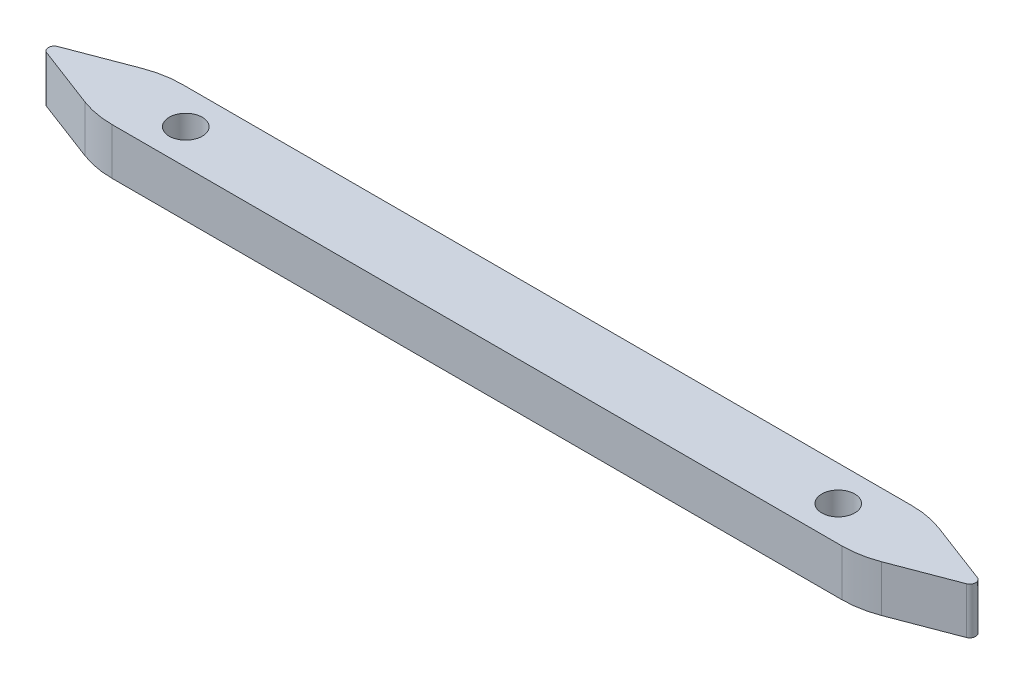
ISO-10303-21;
HEADER;
FILE_DESCRIPTION(('STEP AP214'),'2;1');
FILE_NAME('part.step','',(''),(''),'','','');
FILE_SCHEMA(('AUTOMOTIVE_DESIGN { 1 0 10303 214 1 1 1 1 }'));
ENDSEC;
DATA;
#1=APPLICATION_CONTEXT('core data for automotive mechanical design processes');
#2=APPLICATION_PROTOCOL_DEFINITION('international standard','automotive_design',2000,#1);
#3=PRODUCT_CONTEXT('',#1,'mechanical');
#4=PRODUCT('Part','Part','',(#3));
#5=PRODUCT_RELATED_PRODUCT_CATEGORY('part','',(#4));
#6=PRODUCT_DEFINITION_FORMATION('','',#4);
#7=PRODUCT_DEFINITION_CONTEXT('part definition',#1,'design');
#8=PRODUCT_DEFINITION('design','',#6,#7);
#9=PRODUCT_DEFINITION_SHAPE('','',#8);
#10=(LENGTH_UNIT() NAMED_UNIT(*) SI_UNIT(.MILLI.,.METRE.));
#11=(NAMED_UNIT(*) PLANE_ANGLE_UNIT() SI_UNIT($,.RADIAN.));
#12=(NAMED_UNIT(*) SI_UNIT($,.STERADIAN.) SOLID_ANGLE_UNIT());
#13=UNCERTAINTY_MEASURE_WITH_UNIT(LENGTH_MEASURE(1.E-05),#10,'distance_accuracy_value','');
#14=(GEOMETRIC_REPRESENTATION_CONTEXT(3) GLOBAL_UNCERTAINTY_ASSIGNED_CONTEXT((#13)) GLOBAL_UNIT_ASSIGNED_CONTEXT((#10,
#11,#12)) REPRESENTATION_CONTEXT('',''));
#15=CARTESIAN_POINT('',(0.,0.,0.));
#16=DIRECTION('',(0.,0.,1.));
#17=DIRECTION('',(1.,0.,0.));
#18=AXIS2_PLACEMENT_3D('',#15,#16,#17);
#19=CARTESIAN_POINT('',(-62.3678648511801,-10.,0.));
#20=DIRECTION('',(0.,1.,0.));
#21=DIRECTION('',(0.,0.,1.));
#22=AXIS2_PLACEMENT_3D('',#19,#20,#21);
#23=CYLINDRICAL_SURFACE('',#22,0.793750000000001);
#24=CARTESIAN_POINT('',(-62.3678648511801,9.525,0.));
#25=DIRECTION('',(0.,1.,0.));
#26=DIRECTION('',(0.,0.,1.));
#27=AXIS2_PLACEMENT_3D('',#24,#25,#26);
#28=CIRCLE('',#27,0.793750000000001);
#29=CARTESIAN_POINT('',(-62.6498189486751,9.525,0.741984467092002));
#30=VERTEX_POINT('',#29);
#31=CARTESIAN_POINT('',(-62.6498189486751,9.525,-0.741984467092001));
#32=VERTEX_POINT('',#31);
#33=EDGE_CURVE('E211',#30,#32,#28,.F.);
#34=ORIENTED_EDGE('',*,*,#33,.F.);
#35=DIRECTION('',(0.,1.,0.));
#36=VECTOR('',#35,1.);
#37=CARTESIAN_POINT('',(-62.6498189486751,-10.,0.741984467092001));
#38=LINE('',#37,#36);
#39=CARTESIAN_POINT('',(-62.6498189486751,15.875,0.741984467092002));
#40=VERTEX_POINT('',#39);
#41=EDGE_CURVE('E171',#30,#40,#38,.T.);
#42=ORIENTED_EDGE('',*,*,#41,.T.);
#43=CARTESIAN_POINT('',(-62.3678648511801,15.875,0.));
#44=DIRECTION('',(0.,1.,0.));
#45=DIRECTION('',(0.,0.,1.));
#46=AXIS2_PLACEMENT_3D('',#43,#44,#45);
#47=CIRCLE('',#46,0.793750000000001);
#48=CARTESIAN_POINT('',(-62.6498189486751,15.875,-0.741984467092001));
#49=VERTEX_POINT('',#48);
#50=EDGE_CURVE('E185',#40,#49,#47,.F.);
#51=ORIENTED_EDGE('',*,*,#50,.T.);
#52=DIRECTION('',(0.,1.,0.));
#53=VECTOR('',#52,1.);
#54=CARTESIAN_POINT('',(-62.6498189486751,-10.,-0.741984467092001));
#55=LINE('',#54,#53);
#56=EDGE_CURVE('E170',#32,#49,#55,.T.);
#57=ORIENTED_EDGE('',*,*,#56,.F.);
#58=EDGE_LOOP('',(#34,#42,#51,#57));
#59=FACE_BOUND('',#58,.T.);
#60=ADVANCED_FACE('F33',(#59),#23,.T.);
#61=CARTESIAN_POINT('',(62.3678648511801,-10.,0.));
#62=DIRECTION('',(0.,1.,0.));
#63=DIRECTION('',(0.,0.,1.));
#64=AXIS2_PLACEMENT_3D('',#61,#62,#63);
#65=CYLINDRICAL_SURFACE('',#64,0.793750000000015);
#66=CARTESIAN_POINT('',(62.3678648511801,9.525,0.));
#67=DIRECTION('',(0.,1.,0.));
#68=DIRECTION('',(0.,0.,1.));
#69=AXIS2_PLACEMENT_3D('',#66,#67,#68);
#70=CIRCLE('',#69,0.793750000000015);
#71=CARTESIAN_POINT('',(62.6498189486751,9.525,-0.741984467092015));
#72=VERTEX_POINT('',#71);
#73=CARTESIAN_POINT('',(62.6498189486751,9.525,0.741984467092003));
#74=VERTEX_POINT('',#73);
#75=EDGE_CURVE('E217',#72,#74,#70,.F.);
#76=ORIENTED_EDGE('',*,*,#75,.F.);
#77=DIRECTION('',(0.,1.,0.));
#78=VECTOR('',#77,1.);
#79=CARTESIAN_POINT('',(62.6498189486751,-10.,-0.741984467092032));
#80=LINE('',#79,#78);
#81=CARTESIAN_POINT('',(62.6498189486751,15.875,-0.741984467092015));
#82=VERTEX_POINT('',#81);
#83=EDGE_CURVE('E176',#72,#82,#80,.T.);
#84=ORIENTED_EDGE('',*,*,#83,.T.);
#85=CARTESIAN_POINT('',(62.3678648511801,15.875,0.));
#86=DIRECTION('',(0.,1.,0.));
#87=DIRECTION('',(0.,0.,1.));
#88=AXIS2_PLACEMENT_3D('',#85,#86,#87);
#89=CIRCLE('',#88,0.793750000000015);
#90=CARTESIAN_POINT('',(62.6498189486751,15.875,0.741984467092003));
#91=VERTEX_POINT('',#90);
#92=EDGE_CURVE('E194',#82,#91,#89,.F.);
#93=ORIENTED_EDGE('',*,*,#92,.T.);
#94=DIRECTION('',(0.,1.,0.));
#95=VECTOR('',#94,1.);
#96=CARTESIAN_POINT('',(62.6498189486751,-10.,0.741984467092017));
#97=LINE('',#96,#95);
#98=EDGE_CURVE('E173',#74,#91,#97,.T.);
#99=ORIENTED_EDGE('',*,*,#98,.F.);
#100=EDGE_LOOP('',(#76,#84,#93,#99));
#101=FACE_BOUND('',#100,.T.);
#102=ADVANCED_FACE('F229',(#101),#65,.T.);
#103=CARTESIAN_POINT('',(-41.7162215634645,-10.,-8.69675147347203));
#104=DIRECTION('',(-0.355217760623573,0.,-0.934783580588349));
#105=DIRECTION('',(-0.934783580588349,0.,0.355217760623573));
#106=AXIS2_PLACEMENT_3D('',#103,#104,#105);
#107=PLANE('',#106);
#108=DIRECTION('',(0.934783580588349,0.,-0.355217760623573));
#109=VECTOR('',#108,1.);
#110=CARTESIAN_POINT('',(-41.7162215634645,9.525,-8.69675147347203));
#111=LINE('',#110,#109);
#112=CARTESIAN_POINT('',(-54.2491163003066,9.525,-3.93425147347203));
#113=VERTEX_POINT('',#112);
#114=EDGE_CURVE('E56',#32,#113,#111,.T.);
#115=ORIENTED_EDGE('',*,*,#114,.F.);
#116=ORIENTED_EDGE('',*,*,#56,.T.);
#117=DIRECTION('',(0.934783580588349,0.,-0.355217760623573));
#118=VECTOR('',#117,1.);
#119=CARTESIAN_POINT('',(-41.7162215634645,15.875,-8.69675147347203));
#120=LINE('',#119,#118);
#121=CARTESIAN_POINT('',(-54.2491163003066,15.875,-3.93425147347202));
#122=VERTEX_POINT('',#121);
#123=EDGE_CURVE('E136',#49,#122,#120,.T.);
#124=ORIENTED_EDGE('',*,*,#123,.T.);
#125=DIRECTION('',(0.,-1.,0.));
#126=VECTOR('',#125,1.);
#127=CARTESIAN_POINT('',(-54.2491163003066,-10.,-3.93425147347203));
#128=LINE('',#127,#126);
#129=EDGE_CURVE('E138',#122,#113,#128,.T.);
#130=ORIENTED_EDGE('',*,*,#129,.T.);
#131=EDGE_LOOP('',(#115,#116,#124,#130));
#132=FACE_BOUND('',#131,.T.);
#133=ADVANCED_FACE('F257',(#132),#107,.T.);
#134=CARTESIAN_POINT('',(41.7162215634645,-10.,-8.69675147347204));
#135=DIRECTION('',(0.355217760623573,0.,-0.934783580588349));
#136=DIRECTION('',(-0.934783580588349,0.,-0.355217760623573));
#137=AXIS2_PLACEMENT_3D('',#134,#135,#136);
#138=PLANE('',#137);
#139=DIRECTION('',(0.934783580588349,0.,0.355217760623573));
#140=VECTOR('',#139,1.);
#141=CARTESIAN_POINT('',(41.7162215634645,9.525,-8.69675147347204));
#142=LINE('',#141,#140);
#143=CARTESIAN_POINT('',(54.2491163003067,9.525,-3.93425147347203));
#144=VERTEX_POINT('',#143);
#145=EDGE_CURVE('E219',#144,#72,#142,.T.);
#146=ORIENTED_EDGE('',*,*,#145,.F.);
#147=DIRECTION('',(0.,1.,0.));
#148=VECTOR('',#147,1.);
#149=CARTESIAN_POINT('',(54.2491163003067,-10.,-3.93425147347203));
#150=LINE('',#149,#148);
#151=CARTESIAN_POINT('',(54.2491163003067,15.875,-3.93425147347203));
#152=VERTEX_POINT('',#151);
#153=EDGE_CURVE('E167',#144,#152,#150,.T.);
#154=ORIENTED_EDGE('',*,*,#153,.T.);
#155=DIRECTION('',(0.934783580588349,0.,0.355217760623573));
#156=VECTOR('',#155,1.);
#157=CARTESIAN_POINT('',(41.7162215634645,15.875,-8.69675147347204));
#158=LINE('',#157,#156);
#159=EDGE_CURVE('E197',#152,#82,#158,.T.);
#160=ORIENTED_EDGE('',*,*,#159,.T.);
#161=ORIENTED_EDGE('',*,*,#83,.F.);
#162=EDGE_LOOP('',(#146,#154,#160,#161));
#163=FACE_BOUND('',#162,.T.);
#164=ADVANCED_FACE('F231',(#163),#138,.T.);
#165=CARTESIAN_POINT('',(41.7162215634645,-10.,8.69675147347204));
#166=DIRECTION('',(0.355217760623573,0.,0.934783580588349));
#167=DIRECTION('',(0.934783580588349,0.,-0.355217760623573));
#168=AXIS2_PLACEMENT_3D('',#165,#166,#167);
#169=PLANE('',#168);
#170=DIRECTION('',(-0.934783580588349,0.,0.355217760623573));
#171=VECTOR('',#170,1.);
#172=CARTESIAN_POINT('',(41.7162215634645,9.525,8.69675147347204));
#173=LINE('',#172,#171);
#174=CARTESIAN_POINT('',(54.2491163003067,9.525,3.93425147347203));
#175=VERTEX_POINT('',#174);
#176=EDGE_CURVE('E215',#74,#175,#173,.T.);
#177=ORIENTED_EDGE('',*,*,#176,.F.);
#178=ORIENTED_EDGE('',*,*,#98,.T.);
#179=DIRECTION('',(-0.934783580588349,0.,0.355217760623573));
#180=VECTOR('',#179,1.);
#181=CARTESIAN_POINT('',(41.7162215634645,15.875,8.69675147347204));
#182=LINE('',#181,#180);
#183=CARTESIAN_POINT('',(54.2491163003067,15.875,3.93425147347203));
#184=VERTEX_POINT('',#183);
#185=EDGE_CURVE('E191',#91,#184,#182,.T.);
#186=ORIENTED_EDGE('',*,*,#185,.T.);
#187=DIRECTION('',(0.,-1.,0.));
#188=VECTOR('',#187,1.);
#189=CARTESIAN_POINT('',(54.2491163003067,-10.,3.93425147347203));
#190=LINE('',#189,#188);
#191=EDGE_CURVE('E159',#184,#175,#190,.T.);
#192=ORIENTED_EDGE('',*,*,#191,.T.);
#193=EDGE_LOOP('',(#177,#178,#186,#192));
#194=FACE_BOUND('',#193,.T.);
#195=ADVANCED_FACE('F265',(#194),#169,.T.);
#196=CARTESIAN_POINT('',(-41.7162215634645,-10.,8.69675147347203));
#197=DIRECTION('',(-0.355217760623573,0.,0.934783580588349));
#198=DIRECTION('',(0.934783580588349,0.,0.355217760623573));
#199=AXIS2_PLACEMENT_3D('',#196,#197,#198);
#200=PLANE('',#199);
#201=DIRECTION('',(-0.934783580588349,0.,-0.355217760623573));
#202=VECTOR('',#201,1.);
#203=CARTESIAN_POINT('',(-41.7162215634645,9.525,8.69675147347203));
#204=LINE('',#203,#202);
#205=CARTESIAN_POINT('',(-54.2491163003066,9.525,3.93425147347202));
#206=VERTEX_POINT('',#205);
#207=EDGE_CURVE('E213',#206,#30,#204,.T.);
#208=ORIENTED_EDGE('',*,*,#207,.F.);
#209=DIRECTION('',(0.,1.,0.));
#210=VECTOR('',#209,1.);
#211=CARTESIAN_POINT('',(-54.2491163003066,-10.,3.93425147347203));
#212=LINE('',#211,#210);
#213=CARTESIAN_POINT('',(-54.2491163003066,15.875,3.93425147347202));
#214=VERTEX_POINT('',#213);
#215=EDGE_CURVE('E149',#206,#214,#212,.T.);
#216=ORIENTED_EDGE('',*,*,#215,.T.);
#217=DIRECTION('',(-0.934783580588349,0.,-0.355217760623573));
#218=VECTOR('',#217,1.);
#219=CARTESIAN_POINT('',(-41.7162215634645,15.875,8.69675147347203));
#220=LINE('',#219,#218);
#221=EDGE_CURVE('E188',#214,#40,#220,.T.);
#222=ORIENTED_EDGE('',*,*,#221,.T.);
#223=ORIENTED_EDGE('',*,*,#41,.F.);
#224=EDGE_LOOP('',(#208,#216,#222,#223));
#225=FACE_BOUND('',#224,.T.);
#226=ADVANCED_FACE('F261',(#225),#200,.T.);
#227=CARTESIAN_POINT('',(44.45,22.225,0.));
#228=DIRECTION('',(0.,1.,0.));
#229=DIRECTION('',(0.,0.,1.));
#230=AXIS2_PLACEMENT_3D('',#227,#228,#229);
#231=CYLINDRICAL_SURFACE('',#230,2.24789999999999);
#232=CARTESIAN_POINT('',(44.45,9.525,0.));
#233=DIRECTION('',(0.,1.,0.));
#234=DIRECTION('',(0.,0.,1.));
#235=AXIS2_PLACEMENT_3D('',#232,#233,#234);
#236=CIRCLE('',#235,2.24789999999999);
#237=CARTESIAN_POINT('',(44.45,9.525,2.24789999999999));
#238=VERTEX_POINT('',#237);
#239=EDGE_CURVE('E205',#238,#238,#236,.F.);
#240=ORIENTED_EDGE('',*,*,#239,.T.);
#241=EDGE_LOOP('',(#240));
#242=FACE_BOUND('',#241,.T.);
#243=CARTESIAN_POINT('',(44.45,15.875,0.));
#244=DIRECTION('',(0.,1.,0.));
#245=DIRECTION('',(0.,0.,1.));
#246=AXIS2_PLACEMENT_3D('',#243,#244,#245);
#247=CIRCLE('',#246,2.24789999999999);
#248=CARTESIAN_POINT('',(44.45,15.875,2.24789999999999));
#249=VERTEX_POINT('',#248);
#250=EDGE_CURVE('E200',#249,#249,#247,.F.);
#251=ORIENTED_EDGE('',*,*,#250,.F.);
#252=EDGE_LOOP('',(#251));
#253=FACE_BOUND('',#252,.T.);
#254=ADVANCED_FACE('F264',(#242,#253),#231,.F.);
#255=CARTESIAN_POINT('',(-44.45,22.225,0.));
#256=DIRECTION('',(0.,1.,0.));
#257=DIRECTION('',(0.,0.,1.));
#258=AXIS2_PLACEMENT_3D('',#255,#256,#257);
#259=CYLINDRICAL_SURFACE('',#258,2.24789999999999);
#260=CARTESIAN_POINT('',(-44.45,9.525,0.));
#261=DIRECTION('',(0.,1.,0.));
#262=DIRECTION('',(0.,0.,1.));
#263=AXIS2_PLACEMENT_3D('',#260,#261,#262);
#264=CIRCLE('',#263,2.24789999999999);
#265=CARTESIAN_POINT('',(-44.45,9.525,2.24789999999999));
#266=VERTEX_POINT('',#265);
#267=EDGE_CURVE('E208',#266,#266,#264,.F.);
#268=ORIENTED_EDGE('',*,*,#267,.T.);
#269=EDGE_LOOP('',(#268));
#270=FACE_BOUND('',#269,.T.);
#271=CARTESIAN_POINT('',(-44.45,15.875,0.));
#272=DIRECTION('',(0.,1.,0.));
#273=DIRECTION('',(0.,0.,1.));
#274=AXIS2_PLACEMENT_3D('',#271,#272,#273);
#275=CIRCLE('',#274,2.24789999999999);
#276=CARTESIAN_POINT('',(-44.45,15.875,2.24789999999999));
#277=VERTEX_POINT('',#276);
#278=EDGE_CURVE('E37',#277,#277,#275,.F.);
#279=ORIENTED_EDGE('',*,*,#278,.F.);
#280=EDGE_LOOP('',(#279));
#281=FACE_BOUND('',#280,.T.);
#282=ADVANCED_FACE('F276',(#270,#281),#259,.F.);
#283=CARTESIAN_POINT('',(0.,0.,4.76249999999999));
#284=DIRECTION('',(0.,0.,1.));
#285=DIRECTION('',(1.,0.,0.));
#286=AXIS2_PLACEMENT_3D('',#283,#284,#285);
#287=PLANE('',#286);
#288=DIRECTION('',(-1.,0.,0.));
#289=VECTOR('',#288,1.);
#290=CARTESIAN_POINT('',(-68.6771113456913,15.875,4.76249999999999));
#291=LINE('',#290,#289);
#292=CARTESIAN_POINT('',(49.7378507403873,15.875,4.7625));
#293=VERTEX_POINT('',#292);
#294=CARTESIAN_POINT('',(-49.7378507403872,15.875,4.76249999999999));
#295=VERTEX_POINT('',#294);
#296=EDGE_CURVE('E174',#293,#295,#291,.T.);
#297=ORIENTED_EDGE('',*,*,#296,.T.);
#298=DIRECTION('',(0.,1.,0.));
#299=VECTOR('',#298,1.);
#300=CARTESIAN_POINT('',(-49.7378507403872,0.,4.76249999999999));
#301=LINE('',#300,#299);
#302=CARTESIAN_POINT('',(-49.7378507403872,9.525,4.76249999999999));
#303=VERTEX_POINT('',#302);
#304=EDGE_CURVE('E146',#295,#303,#301,.F.);
#305=ORIENTED_EDGE('',*,*,#304,.T.);
#306=DIRECTION('',(1.,0.,0.));
#307=VECTOR('',#306,1.);
#308=CARTESIAN_POINT('',(-68.6771113456913,9.525,4.76249999999999));
#309=LINE('',#308,#307);
#310=CARTESIAN_POINT('',(49.7378507403873,9.525,4.7625));
#311=VERTEX_POINT('',#310);
#312=EDGE_CURVE('E181',#303,#311,#309,.T.);
#313=ORIENTED_EDGE('',*,*,#312,.T.);
#314=DIRECTION('',(0.,-1.,0.));
#315=VECTOR('',#314,1.);
#316=CARTESIAN_POINT('',(49.7378507403873,0.,4.76249999999999));
#317=LINE('',#316,#315);
#318=EDGE_CURVE('E156',#311,#293,#317,.F.);
#319=ORIENTED_EDGE('',*,*,#318,.T.);
#320=EDGE_LOOP('',(#297,#305,#313,#319));
#321=FACE_BOUND('',#320,.T.);
#322=ADVANCED_FACE('F248',(#321),#287,.T.);
#323=CARTESIAN_POINT('',(0.,0.,-4.76249999999999));
#324=DIRECTION('',(0.,0.,-1.));
#325=DIRECTION('',(-1.,0.,0.));
#326=AXIS2_PLACEMENT_3D('',#323,#324,#325);
#327=PLANE('',#326);
#328=DIRECTION('',(-1.,0.,0.));
#329=VECTOR('',#328,1.);
#330=CARTESIAN_POINT('',(67.7785323187383,9.525,-4.76249999999999));
#331=LINE('',#330,#329);
#332=CARTESIAN_POINT('',(49.7378507403873,9.525,-4.76249999999999));
#333=VERTEX_POINT('',#332);
#334=CARTESIAN_POINT('',(-49.7378507403872,9.525,-4.7625));
#335=VERTEX_POINT('',#334);
#336=EDGE_CURVE('E122',#333,#335,#331,.T.);
#337=ORIENTED_EDGE('',*,*,#336,.T.);
#338=DIRECTION('',(0.,-1.,0.));
#339=VECTOR('',#338,1.);
#340=CARTESIAN_POINT('',(-49.7378507403872,0.,-4.76249999999999));
#341=LINE('',#340,#339);
#342=CARTESIAN_POINT('',(-49.7378507403872,15.875,-4.76249999999999));
#343=VERTEX_POINT('',#342);
#344=EDGE_CURVE('E128',#335,#343,#341,.F.);
#345=ORIENTED_EDGE('',*,*,#344,.T.);
#346=DIRECTION('',(1.,0.,0.));
#347=VECTOR('',#346,1.);
#348=CARTESIAN_POINT('',(67.7785323187383,15.875,-4.76249999999999));
#349=LINE('',#348,#347);
#350=CARTESIAN_POINT('',(49.7378507403873,15.875,-4.76249999999999));
#351=VERTEX_POINT('',#350);
#352=EDGE_CURVE('E48',#343,#351,#349,.T.);
#353=ORIENTED_EDGE('',*,*,#352,.T.);
#354=DIRECTION('',(0.,1.,0.));
#355=VECTOR('',#354,1.);
#356=CARTESIAN_POINT('',(49.7378507403873,0.,-4.76249999999999));
#357=LINE('',#356,#355);
#358=EDGE_CURVE('E134',#351,#333,#357,.F.);
#359=ORIENTED_EDGE('',*,*,#358,.T.);
#360=EDGE_LOOP('',(#337,#345,#353,#359));
#361=FACE_BOUND('',#360,.T.);
#362=ADVANCED_FACE('F131',(#361),#327,.T.);
#363=CARTESIAN_POINT('',(49.7378507403873,-10.,7.9375));
#364=DIRECTION('',(0.,1.,0.));
#365=DIRECTION('',(0.,0.,1.));
#366=AXIS2_PLACEMENT_3D('',#363,#364,#365);
#367=CYLINDRICAL_SURFACE('',#366,12.7);
#368=CARTESIAN_POINT('',(49.7378507403873,9.525,7.9375));
#369=DIRECTION('',(0.,-1.,0.));
#370=DIRECTION('',(0.,0.,-1.));
#371=AXIS2_PLACEMENT_3D('',#368,#369,#370);
#372=CIRCLE('',#371,12.7);
#373=EDGE_CURVE('E162',#333,#144,#372,.T.);
#374=ORIENTED_EDGE('',*,*,#373,.F.);
#375=ORIENTED_EDGE('',*,*,#358,.F.);
#376=CARTESIAN_POINT('',(49.7378507403873,15.875,7.9375));
#377=DIRECTION('',(0.,1.,0.));
#378=DIRECTION('',(0.,0.,1.));
#379=AXIS2_PLACEMENT_3D('',#376,#377,#378);
#380=CIRCLE('',#379,12.7);
#381=EDGE_CURVE('E164',#152,#351,#380,.T.);
#382=ORIENTED_EDGE('',*,*,#381,.F.);
#383=ORIENTED_EDGE('',*,*,#153,.F.);
#384=EDGE_LOOP('',(#374,#375,#382,#383));
#385=FACE_BOUND('',#384,.T.);
#386=ADVANCED_FACE('F237',(#385),#367,.T.);
#387=CARTESIAN_POINT('',(49.7378507403873,-10.,-7.9375));
#388=DIRECTION('',(0.,-1.,0.));
#389=DIRECTION('',(0.,0.,-1.));
#390=AXIS2_PLACEMENT_3D('',#387,#388,#389);
#391=CYLINDRICAL_SURFACE('',#390,12.7);
#392=CARTESIAN_POINT('',(49.7378507403873,15.875,-7.9375));
#393=DIRECTION('',(0.,1.,0.));
#394=DIRECTION('',(0.,0.,1.));
#395=AXIS2_PLACEMENT_3D('',#392,#393,#394);
#396=CIRCLE('',#395,12.7);
#397=EDGE_CURVE('E152',#293,#184,#396,.T.);
#398=ORIENTED_EDGE('',*,*,#397,.F.);
#399=ORIENTED_EDGE('',*,*,#318,.F.);
#400=CARTESIAN_POINT('',(49.7378507403873,9.525,-7.9375));
#401=DIRECTION('',(0.,-1.,0.));
#402=DIRECTION('',(0.,0.,-1.));
#403=AXIS2_PLACEMENT_3D('',#400,#401,#402);
#404=CIRCLE('',#403,12.7);
#405=EDGE_CURVE('E154',#175,#311,#404,.T.);
#406=ORIENTED_EDGE('',*,*,#405,.F.);
#407=ORIENTED_EDGE('',*,*,#191,.F.);
#408=EDGE_LOOP('',(#398,#399,#406,#407));
#409=FACE_BOUND('',#408,.T.);
#410=ADVANCED_FACE('F239',(#409),#391,.T.);
#411=CARTESIAN_POINT('',(-49.7378507403872,-10.,-7.9375));
#412=DIRECTION('',(0.,1.,0.));
#413=DIRECTION('',(0.,0.,1.));
#414=AXIS2_PLACEMENT_3D('',#411,#412,#413);
#415=CYLINDRICAL_SURFACE('',#414,12.7);
#416=CARTESIAN_POINT('',(-49.7378507403872,9.525,-7.9375));
#417=DIRECTION('',(0.,-1.,0.));
#418=DIRECTION('',(0.,0.,-1.));
#419=AXIS2_PLACEMENT_3D('',#416,#417,#418);
#420=CIRCLE('',#419,12.7);
#421=EDGE_CURVE('E140',#303,#206,#420,.T.);
#422=ORIENTED_EDGE('',*,*,#421,.F.);
#423=ORIENTED_EDGE('',*,*,#304,.F.);
#424=CARTESIAN_POINT('',(-49.7378507403872,15.875,-7.9375));
#425=DIRECTION('',(0.,1.,0.));
#426=DIRECTION('',(0.,0.,1.));
#427=AXIS2_PLACEMENT_3D('',#424,#425,#426);
#428=CIRCLE('',#427,12.7);
#429=EDGE_CURVE('E144',#214,#295,#428,.T.);
#430=ORIENTED_EDGE('',*,*,#429,.F.);
#431=ORIENTED_EDGE('',*,*,#215,.F.);
#432=EDGE_LOOP('',(#422,#423,#430,#431));
#433=FACE_BOUND('',#432,.T.);
#434=ADVANCED_FACE('F245',(#433),#415,.T.);
#435=CARTESIAN_POINT('',(-49.7378507403872,-10.,7.9375));
#436=DIRECTION('',(0.,-1.,0.));
#437=DIRECTION('',(0.,0.,-1.));
#438=AXIS2_PLACEMENT_3D('',#435,#436,#437);
#439=CYLINDRICAL_SURFACE('',#438,12.7);
#440=CARTESIAN_POINT('',(-49.7378507403872,15.875,7.9375));
#441=DIRECTION('',(0.,1.,0.));
#442=DIRECTION('',(0.,0.,1.));
#443=AXIS2_PLACEMENT_3D('',#440,#441,#442);
#444=CIRCLE('',#443,12.7);
#445=EDGE_CURVE('E11',#343,#122,#444,.T.);
#446=ORIENTED_EDGE('',*,*,#445,.F.);
#447=ORIENTED_EDGE('',*,*,#344,.F.);
#448=CARTESIAN_POINT('',(-49.7378507403872,9.525,7.9375));
#449=DIRECTION('',(0.,-1.,0.));
#450=DIRECTION('',(0.,0.,-1.));
#451=AXIS2_PLACEMENT_3D('',#448,#449,#450);
#452=CIRCLE('',#451,12.7);
#453=EDGE_CURVE('E42',#113,#335,#452,.T.);
#454=ORIENTED_EDGE('',*,*,#453,.F.);
#455=ORIENTED_EDGE('',*,*,#129,.F.);
#456=EDGE_LOOP('',(#446,#447,#454,#455));
#457=FACE_BOUND('',#456,.T.);
#458=ADVANCED_FACE('F35',(#457),#439,.T.);
#459=CARTESIAN_POINT('',(0.,15.875,0.));
#460=DIRECTION('',(0.,1.,0.));
#461=DIRECTION('',(0.,0.,1.));
#462=AXIS2_PLACEMENT_3D('',#459,#460,#461);
#463=PLANE('',#462);
#464=ORIENTED_EDGE('',*,*,#250,.T.);
#465=EDGE_LOOP('',(#464));
#466=FACE_BOUND('',#465,.T.);
#467=ORIENTED_EDGE('',*,*,#278,.T.);
#468=EDGE_LOOP('',(#467));
#469=FACE_BOUND('',#468,.T.);
#470=ORIENTED_EDGE('',*,*,#50,.F.);
#471=ORIENTED_EDGE('',*,*,#221,.F.);
#472=ORIENTED_EDGE('',*,*,#429,.T.);
#473=ORIENTED_EDGE('',*,*,#296,.F.);
#474=ORIENTED_EDGE('',*,*,#397,.T.);
#475=ORIENTED_EDGE('',*,*,#185,.F.);
#476=ORIENTED_EDGE('',*,*,#92,.F.);
#477=ORIENTED_EDGE('',*,*,#159,.F.);
#478=ORIENTED_EDGE('',*,*,#381,.T.);
#479=ORIENTED_EDGE('',*,*,#352,.F.);
#480=ORIENTED_EDGE('',*,*,#445,.T.);
#481=ORIENTED_EDGE('',*,*,#123,.F.);
#482=EDGE_LOOP('',(#470,#471,#472,#473,#474,#475,#476,#477,#478,#479,#480,#481));
#483=FACE_BOUND('',#482,.T.);
#484=ADVANCED_FACE('F234',(#466,#469,#483),#463,.T.);
#485=CARTESIAN_POINT('',(0.,9.525,0.));
#486=DIRECTION('',(0.,1.,0.));
#487=DIRECTION('',(0.,0.,1.));
#488=AXIS2_PLACEMENT_3D('',#485,#486,#487);
#489=PLANE('',#488);
#490=ORIENTED_EDGE('',*,*,#267,.F.);
#491=EDGE_LOOP('',(#490));
#492=FACE_BOUND('',#491,.T.);
#493=ORIENTED_EDGE('',*,*,#114,.T.);
#494=ORIENTED_EDGE('',*,*,#453,.T.);
#495=ORIENTED_EDGE('',*,*,#336,.F.);
#496=ORIENTED_EDGE('',*,*,#373,.T.);
#497=ORIENTED_EDGE('',*,*,#145,.T.);
#498=ORIENTED_EDGE('',*,*,#75,.T.);
#499=ORIENTED_EDGE('',*,*,#176,.T.);
#500=ORIENTED_EDGE('',*,*,#405,.T.);
#501=ORIENTED_EDGE('',*,*,#312,.F.);
#502=ORIENTED_EDGE('',*,*,#421,.T.);
#503=ORIENTED_EDGE('',*,*,#207,.T.);
#504=ORIENTED_EDGE('',*,*,#33,.T.);
#505=EDGE_LOOP('',(#493,#494,#495,#496,#497,#498,#499,#500,#501,#502,#503,#504));
#506=FACE_BOUND('',#505,.T.);
#507=ORIENTED_EDGE('',*,*,#239,.F.);
#508=EDGE_LOOP('',(#507));
#509=FACE_BOUND('',#508,.T.);
#510=ADVANCED_FACE('F120',(#492,#506,#509),#489,.F.);
#511=CLOSED_SHELL('',(#60,#102,#133,#164,#195,#226,#254,#282,#322,#362,#386,#410,#434,#458,#484,#510));
#512=MANIFOLD_SOLID_BREP('B2',#511);
#513=ADVANCED_BREP_SHAPE_REPRESENTATION('',(#18,#512),#14);
#514=SHAPE_DEFINITION_REPRESENTATION(#9,#513);
ENDSEC;
END-ISO-10303-21;
